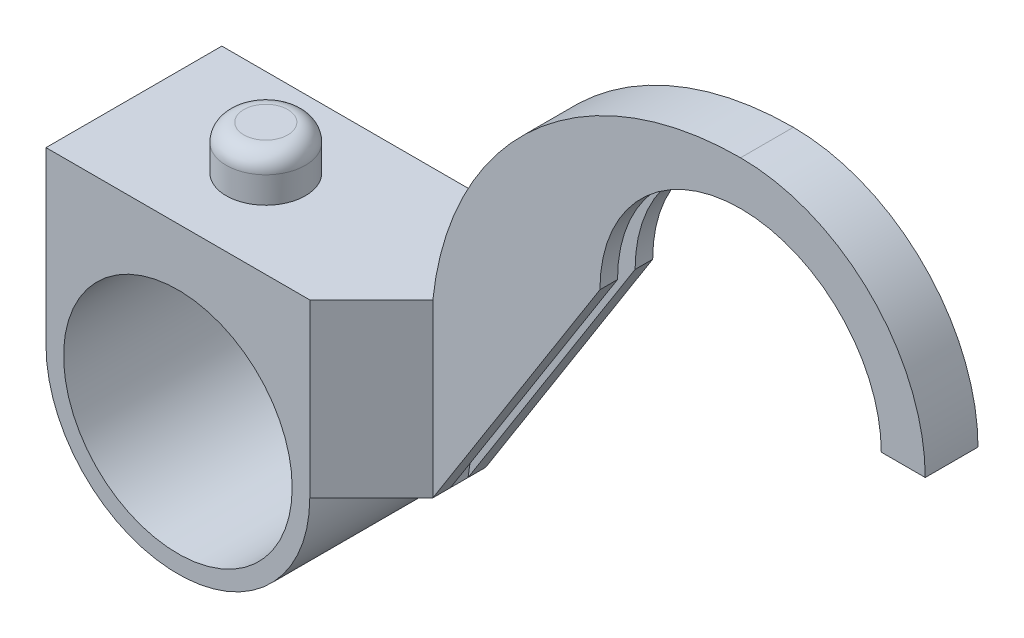
ISO-10303-21;
HEADER;
FILE_DESCRIPTION(('STEP AP214'),'2;1');
FILE_NAME('part.step','',(''),(''),'','','');
FILE_SCHEMA(('AUTOMOTIVE_DESIGN { 1 0 10303 214 1 1 1 1 }'));
ENDSEC;
DATA;
#1=APPLICATION_CONTEXT('core data for automotive mechanical design processes');
#2=APPLICATION_PROTOCOL_DEFINITION('international standard','automotive_design',2000,#1);
#3=PRODUCT_CONTEXT('',#1,'mechanical');
#4=PRODUCT('Part','Part','',(#3));
#5=PRODUCT_RELATED_PRODUCT_CATEGORY('part','',(#4));
#6=PRODUCT_DEFINITION_FORMATION('','',#4);
#7=PRODUCT_DEFINITION_CONTEXT('part definition',#1,'design');
#8=PRODUCT_DEFINITION('design','',#6,#7);
#9=PRODUCT_DEFINITION_SHAPE('','',#8);
#10=(LENGTH_UNIT() NAMED_UNIT(*) SI_UNIT(.MILLI.,.METRE.));
#11=(NAMED_UNIT(*) PLANE_ANGLE_UNIT() SI_UNIT($,.RADIAN.));
#12=(NAMED_UNIT(*) SI_UNIT($,.STERADIAN.) SOLID_ANGLE_UNIT());
#13=UNCERTAINTY_MEASURE_WITH_UNIT(LENGTH_MEASURE(1.E-05),#10,'distance_accuracy_value','');
#14=(GEOMETRIC_REPRESENTATION_CONTEXT(3) GLOBAL_UNCERTAINTY_ASSIGNED_CONTEXT((#13)) GLOBAL_UNIT_ASSIGNED_CONTEXT((#10,
#11,#12)) REPRESENTATION_CONTEXT('',''));
#15=CARTESIAN_POINT('',(0.,0.,0.));
#16=DIRECTION('',(0.,0.,1.));
#17=DIRECTION('',(1.,0.,0.));
#18=AXIS2_PLACEMENT_3D('',#15,#16,#17);
#19=CARTESIAN_POINT('',(57.,30.,1.));
#20=DIRECTION('',(0.,0.,1.));
#21=DIRECTION('',(1.,0.,0.));
#22=AXIS2_PLACEMENT_3D('',#19,#20,#21);
#23=CYLINDRICAL_SURFACE('',#22,16.);
#24=CARTESIAN_POINT('',(57.,30.,3.));
#25=DIRECTION('',(0.,0.,-1.));
#26=DIRECTION('',(1.,0.,0.));
#27=AXIS2_PLACEMENT_3D('',#24,#25,#26);
#28=CIRCLE('',#27,16.);
#29=CARTESIAN_POINT('',(41.,30.,3.));
#30=VERTEX_POINT('',#29);
#31=CARTESIAN_POINT('',(73.,30.,3.));
#32=VERTEX_POINT('',#31);
#33=EDGE_CURVE('E163',#30,#32,#28,.T.);
#34=ORIENTED_EDGE('',*,*,#33,.F.);
#35=DIRECTION('',(0.,0.,1.));
#36=VECTOR('',#35,1.);
#37=CARTESIAN_POINT('',(41.,30.,1.));
#38=LINE('',#37,#36);
#39=CARTESIAN_POINT('',(41.,30.,1.));
#40=VERTEX_POINT('',#39);
#41=EDGE_CURVE('E60',#40,#30,#38,.T.);
#42=ORIENTED_EDGE('',*,*,#41,.F.);
#43=CARTESIAN_POINT('',(57.,30.,1.));
#44=DIRECTION('',(0.,0.,-1.));
#45=DIRECTION('',(1.,0.,0.));
#46=AXIS2_PLACEMENT_3D('',#43,#44,#45);
#47=CIRCLE('',#46,16.);
#48=CARTESIAN_POINT('',(73.,30.,1.));
#49=VERTEX_POINT('',#48);
#50=EDGE_CURVE('E275',#40,#49,#47,.T.);
#51=ORIENTED_EDGE('',*,*,#50,.T.);
#52=DIRECTION('',(0.,0.,1.));
#53=VECTOR('',#52,1.);
#54=CARTESIAN_POINT('',(73.,30.,1.));
#55=LINE('',#54,#53);
#56=EDGE_CURVE('E83',#49,#32,#55,.T.);
#57=ORIENTED_EDGE('',*,*,#56,.T.);
#58=EDGE_LOOP('',(#34,#42,#51,#57));
#59=FACE_BOUND('',#58,.T.);
#60=ADVANCED_FACE('F43',(#59),#23,.F.);
#61=CARTESIAN_POINT('',(41.,30.,1.));
#62=DIRECTION('',(0.844819075554229,-0.535052081184345,0.));
#63=DIRECTION('',(0.535052081184345,0.844819075554229,0.));
#64=AXIS2_PLACEMENT_3D('',#61,#62,#63);
#65=PLANE('',#64);
#66=DIRECTION('',(0.535052081184345,0.844819075554228,0.));
#67=VECTOR('',#66,1.);
#68=CARTESIAN_POINT('',(41.,30.,3.));
#69=LINE('',#68,#67);
#70=CARTESIAN_POINT('',(22.,0.,3.));
#71=VERTEX_POINT('',#70);
#72=EDGE_CURVE('E74',#71,#30,#69,.T.);
#73=ORIENTED_EDGE('',*,*,#72,.F.);
#74=DIRECTION('',(0.,0.,-1.));
#75=VECTOR('',#74,1.);
#76=CARTESIAN_POINT('',(22.,0.,-3.));
#77=LINE('',#76,#75);
#78=CARTESIAN_POINT('',(22.,0.,1.));
#79=VERTEX_POINT('',#78);
#80=EDGE_CURVE('E197',#71,#79,#77,.T.);
#81=ORIENTED_EDGE('',*,*,#80,.T.);
#82=DIRECTION('',(0.535052081184345,0.844819075554228,0.));
#83=VECTOR('',#82,1.);
#84=CARTESIAN_POINT('',(41.,30.,1.));
#85=LINE('',#84,#83);
#86=EDGE_CURVE('E285',#79,#40,#85,.T.);
#87=ORIENTED_EDGE('',*,*,#86,.T.);
#88=ORIENTED_EDGE('',*,*,#41,.T.);
#89=EDGE_LOOP('',(#73,#81,#87,#88));
#90=FACE_BOUND('',#89,.T.);
#91=ADVANCED_FACE('F307',(#90),#65,.T.);
#92=CARTESIAN_POINT('',(73.,30.,1.));
#93=DIRECTION('',(0.,-1.,0.));
#94=DIRECTION('',(1.,0.,0.));
#95=AXIS2_PLACEMENT_3D('',#92,#93,#94);
#96=PLANE('',#95);
#97=DIRECTION('',(1.,0.,0.));
#98=VECTOR('',#97,1.);
#99=CARTESIAN_POINT('',(73.,30.,3.));
#100=LINE('',#99,#98);
#101=CARTESIAN_POINT('',(78.,30.,3.));
#102=VERTEX_POINT('',#101);
#103=EDGE_CURVE('E156',#32,#102,#100,.T.);
#104=ORIENTED_EDGE('',*,*,#103,.F.);
#105=ORIENTED_EDGE('',*,*,#56,.F.);
#106=DIRECTION('',(1.,0.,0.));
#107=VECTOR('',#106,1.);
#108=CARTESIAN_POINT('',(73.,30.,1.));
#109=LINE('',#108,#107);
#110=CARTESIAN_POINT('',(76.,30.,1.));
#111=VERTEX_POINT('',#110);
#112=EDGE_CURVE('E277',#49,#111,#109,.T.);
#113=ORIENTED_EDGE('',*,*,#112,.T.);
#114=DIRECTION('',(0.,0.,-1.));
#115=VECTOR('',#114,1.);
#116=CARTESIAN_POINT('',(76.,30.,3.));
#117=LINE('',#116,#115);
#118=CARTESIAN_POINT('',(76.,30.,-1.));
#119=VERTEX_POINT('',#118);
#120=EDGE_CURVE('E172',#111,#119,#117,.T.);
#121=ORIENTED_EDGE('',*,*,#120,.T.);
#122=DIRECTION('',(1.,0.,0.));
#123=VECTOR('',#122,1.);
#124=CARTESIAN_POINT('',(73.,30.,-1.));
#125=LINE('',#124,#123);
#126=CARTESIAN_POINT('',(73.,30.,-1.));
#127=VERTEX_POINT('',#126);
#128=EDGE_CURVE('E251',#127,#119,#125,.T.);
#129=ORIENTED_EDGE('',*,*,#128,.F.);
#130=DIRECTION('',(0.,0.,-1.));
#131=VECTOR('',#130,1.);
#132=CARTESIAN_POINT('',(73.,30.,-1.));
#133=LINE('',#132,#131);
#134=CARTESIAN_POINT('',(73.,30.,-3.));
#135=VERTEX_POINT('',#134);
#136=EDGE_CURVE('E263',#127,#135,#133,.T.);
#137=ORIENTED_EDGE('',*,*,#136,.T.);
#138=DIRECTION('',(1.,0.,0.));
#139=VECTOR('',#138,1.);
#140=CARTESIAN_POINT('',(73.,30.,-3.));
#141=LINE('',#140,#139);
#142=CARTESIAN_POINT('',(78.,30.,-3.));
#143=VERTEX_POINT('',#142);
#144=EDGE_CURVE('E169',#135,#143,#141,.T.);
#145=ORIENTED_EDGE('',*,*,#144,.T.);
#146=DIRECTION('',(0.,0.,-1.));
#147=VECTOR('',#146,1.);
#148=CARTESIAN_POINT('',(78.,30.,3.));
#149=LINE('',#148,#147);
#150=EDGE_CURVE('E166',#102,#143,#149,.T.);
#151=ORIENTED_EDGE('',*,*,#150,.F.);
#152=EDGE_LOOP('',(#104,#105,#113,#121,#129,#137,#145,#151));
#153=FACE_BOUND('',#152,.T.);
#154=ADVANCED_FACE('F167',(#153),#96,.T.);
#155=CARTESIAN_POINT('',(57.,30.,1.));
#156=DIRECTION('',(0.,0.,1.));
#157=DIRECTION('',(1.,0.,0.));
#158=AXIS2_PLACEMENT_3D('',#155,#156,#157);
#159=PLANE('',#158);
#160=ORIENTED_EDGE('',*,*,#50,.F.);
#161=ORIENTED_EDGE('',*,*,#86,.F.);
#162=CARTESIAN_POINT('',(93.8029379826637,-8.57198833355658,1.));
#163=DIRECTION('',(0.,0.,1.));
#164=DIRECTION('',(-1.,0.,0.));
#165=AXIS2_PLACEMENT_3D('',#162,#163,#164);
#166=CIRCLE('',#165,72.3127989150805);
#167=CARTESIAN_POINT('',(43.8839033796665,43.7465635504324,1.));
#168=VERTEX_POINT('',#167);
#169=EDGE_CURVE('E282',#168,#79,#166,.T.);
#170=ORIENTED_EDGE('',*,*,#169,.F.);
#171=CARTESIAN_POINT('',(57.,30.,1.));
#172=DIRECTION('',(0.,0.,1.));
#173=DIRECTION('',(1.,0.,0.));
#174=AXIS2_PLACEMENT_3D('',#171,#172,#173);
#175=CIRCLE('',#174,19.);
#176=EDGE_CURVE('E279',#111,#168,#175,.T.);
#177=ORIENTED_EDGE('',*,*,#176,.F.);
#178=ORIENTED_EDGE('',*,*,#112,.F.);
#179=EDGE_LOOP('',(#160,#161,#170,#177,#178));
#180=FACE_BOUND('',#179,.T.);
#181=ADVANCED_FACE('F316',(#180),#159,.F.);
#182=CARTESIAN_POINT('',(57.,30.,3.));
#183=DIRECTION('',(0.,0.,1.));
#184=DIRECTION('',(1.,0.,0.));
#185=AXIS2_PLACEMENT_3D('',#182,#183,#184);
#186=PLANE('',#185);
#187=ORIENTED_EDGE('',*,*,#33,.T.);
#188=ORIENTED_EDGE('',*,*,#103,.T.);
#189=CARTESIAN_POINT('',(57.,30.,3.));
#190=DIRECTION('',(0.,0.,1.));
#191=DIRECTION('',(-1.,0.,0.));
#192=AXIS2_PLACEMENT_3D('',#189,#190,#191);
#193=CIRCLE('',#192,21.);
#194=CARTESIAN_POINT('',(57.,51.,3.));
#195=VERTEX_POINT('',#194);
#196=EDGE_CURVE('E161',#102,#195,#193,.T.);
#197=ORIENTED_EDGE('',*,*,#196,.T.);
#198=CARTESIAN_POINT('',(57.,15.8055555555556,3.));
#199=DIRECTION('',(0.,0.,1.));
#200=DIRECTION('',(-1.,0.,0.));
#201=AXIS2_PLACEMENT_3D('',#198,#199,#200);
#202=CIRCLE('',#201,35.1944444444444);
#203=CARTESIAN_POINT('',(22.,19.5,3.));
#204=VERTEX_POINT('',#203);
#205=EDGE_CURVE('E178',#195,#204,#202,.T.);
#206=ORIENTED_EDGE('',*,*,#205,.T.);
#207=DIRECTION('',(0.,1.,0.));
#208=VECTOR('',#207,1.);
#209=CARTESIAN_POINT('',(22.,0.,3.));
#210=LINE('',#209,#208);
#211=EDGE_CURVE('E202',#71,#204,#210,.T.);
#212=ORIENTED_EDGE('',*,*,#211,.F.);
#213=ORIENTED_EDGE('',*,*,#72,.T.);
#214=EDGE_LOOP('',(#187,#188,#197,#206,#212,#213));
#215=FACE_BOUND('',#214,.T.);
#216=ADVANCED_FACE('F158',(#215),#186,.T.);
#217=CARTESIAN_POINT('',(93.8029379826633,-8.57198833355644,3.));
#218=DIRECTION('',(0.,0.,-1.));
#219=DIRECTION('',(-1.,0.,0.));
#220=AXIS2_PLACEMENT_3D('',#217,#218,#219);
#221=CYLINDRICAL_SURFACE('',#220,72.3127989150802);
#222=DIRECTION('',(0.,0.,-1.));
#223=VECTOR('',#222,1.);
#224=CARTESIAN_POINT('',(43.8839033796665,43.7465635504324,3.));
#225=LINE('',#224,#223);
#226=CARTESIAN_POINT('',(43.8839033796665,43.7465635504324,-1.));
#227=VERTEX_POINT('',#226);
#228=EDGE_CURVE('E189',#168,#227,#225,.T.);
#229=ORIENTED_EDGE('',*,*,#228,.F.);
#230=ORIENTED_EDGE('',*,*,#169,.T.);
#231=CARTESIAN_POINT('',(22.,0.,-1.));
#232=VERTEX_POINT('',#231);
#233=EDGE_CURVE('E195',#79,#232,#77,.T.);
#234=ORIENTED_EDGE('',*,*,#233,.T.);
#235=CARTESIAN_POINT('',(93.8029379826637,-8.57198833355658,-1.));
#236=DIRECTION('',(0.,0.,1.));
#237=DIRECTION('',(-1.,0.,0.));
#238=AXIS2_PLACEMENT_3D('',#235,#236,#237);
#239=CIRCLE('',#238,72.3127989150805);
#240=EDGE_CURVE('E258',#227,#232,#239,.T.);
#241=ORIENTED_EDGE('',*,*,#240,.F.);
#242=EDGE_LOOP('',(#229,#230,#234,#241));
#243=FACE_BOUND('',#242,.T.);
#244=ADVANCED_FACE('F320',(#243),#221,.F.);
#245=CARTESIAN_POINT('',(57.,30.,3.));
#246=DIRECTION('',(0.,0.,-1.));
#247=DIRECTION('',(-1.,0.,0.));
#248=AXIS2_PLACEMENT_3D('',#245,#246,#247);
#249=CYLINDRICAL_SURFACE('',#248,19.);
#250=ORIENTED_EDGE('',*,*,#120,.F.);
#251=ORIENTED_EDGE('',*,*,#176,.T.);
#252=ORIENTED_EDGE('',*,*,#228,.T.);
#253=CARTESIAN_POINT('',(57.,30.,-1.));
#254=DIRECTION('',(0.,0.,1.));
#255=DIRECTION('',(1.,0.,0.));
#256=AXIS2_PLACEMENT_3D('',#253,#254,#255);
#257=CIRCLE('',#256,19.);
#258=EDGE_CURVE('E255',#119,#227,#257,.T.);
#259=ORIENTED_EDGE('',*,*,#258,.F.);
#260=EDGE_LOOP('',(#250,#251,#252,#259));
#261=FACE_BOUND('',#260,.T.);
#262=ADVANCED_FACE('F328',(#261),#249,.F.);
#263=CARTESIAN_POINT('',(57.,30.,-1.));
#264=DIRECTION('',(0.,0.,-1.));
#265=DIRECTION('',(1.,0.,0.));
#266=AXIS2_PLACEMENT_3D('',#263,#264,#265);
#267=CYLINDRICAL_SURFACE('',#266,16.);
#268=CARTESIAN_POINT('',(57.,30.,-3.));
#269=DIRECTION('',(0.,0.,-1.));
#270=DIRECTION('',(1.,0.,0.));
#271=AXIS2_PLACEMENT_3D('',#268,#269,#270);
#272=CIRCLE('',#271,16.);
#273=CARTESIAN_POINT('',(41.,30.,-3.));
#274=VERTEX_POINT('',#273);
#275=EDGE_CURVE('E247',#274,#135,#272,.T.);
#276=ORIENTED_EDGE('',*,*,#275,.T.);
#277=ORIENTED_EDGE('',*,*,#136,.F.);
#278=CARTESIAN_POINT('',(57.,30.,-1.));
#279=DIRECTION('',(0.,0.,-1.));
#280=DIRECTION('',(1.,0.,0.));
#281=AXIS2_PLACEMENT_3D('',#278,#279,#280);
#282=CIRCLE('',#281,16.);
#283=CARTESIAN_POINT('',(41.,30.,-1.));
#284=VERTEX_POINT('',#283);
#285=EDGE_CURVE('E248',#284,#127,#282,.T.);
#286=ORIENTED_EDGE('',*,*,#285,.F.);
#287=DIRECTION('',(0.,0.,-1.));
#288=VECTOR('',#287,1.);
#289=CARTESIAN_POINT('',(41.,30.,-1.));
#290=LINE('',#289,#288);
#291=EDGE_CURVE('E268',#284,#274,#290,.T.);
#292=ORIENTED_EDGE('',*,*,#291,.T.);
#293=EDGE_LOOP('',(#276,#277,#286,#292));
#294=FACE_BOUND('',#293,.T.);
#295=ADVANCED_FACE('F324',(#294),#267,.F.);
#296=CARTESIAN_POINT('',(41.,30.,-1.));
#297=DIRECTION('',(0.844819075554229,-0.535052081184345,0.));
#298=DIRECTION('',(0.535052081184345,0.844819075554229,0.));
#299=AXIS2_PLACEMENT_3D('',#296,#297,#298);
#300=PLANE('',#299);
#301=DIRECTION('',(0.535052081184345,0.844819075554228,0.));
#302=VECTOR('',#301,1.);
#303=CARTESIAN_POINT('',(41.,30.,-3.));
#304=LINE('',#303,#302);
#305=CARTESIAN_POINT('',(22.,0.,-3.));
#306=VERTEX_POINT('',#305);
#307=EDGE_CURVE('E252',#306,#274,#304,.T.);
#308=ORIENTED_EDGE('',*,*,#307,.T.);
#309=ORIENTED_EDGE('',*,*,#291,.F.);
#310=DIRECTION('',(0.535052081184345,0.844819075554228,0.));
#311=VECTOR('',#310,1.);
#312=CARTESIAN_POINT('',(41.,30.,-1.));
#313=LINE('',#312,#311);
#314=EDGE_CURVE('E261',#232,#284,#313,.T.);
#315=ORIENTED_EDGE('',*,*,#314,.F.);
#316=DIRECTION('',(0.,0.,-1.));
#317=VECTOR('',#316,1.);
#318=CARTESIAN_POINT('',(22.,0.,-1.));
#319=LINE('',#318,#317);
#320=EDGE_CURVE('E271',#232,#306,#319,.T.);
#321=ORIENTED_EDGE('',*,*,#320,.T.);
#322=EDGE_LOOP('',(#308,#309,#315,#321));
#323=FACE_BOUND('',#322,.T.);
#324=ADVANCED_FACE('F327',(#323),#300,.T.);
#325=CARTESIAN_POINT('',(57.,30.,-1.));
#326=DIRECTION('',(0.,0.,-1.));
#327=DIRECTION('',(1.,0.,0.));
#328=AXIS2_PLACEMENT_3D('',#325,#326,#327);
#329=PLANE('',#328);
#330=ORIENTED_EDGE('',*,*,#285,.T.);
#331=ORIENTED_EDGE('',*,*,#128,.T.);
#332=ORIENTED_EDGE('',*,*,#258,.T.);
#333=ORIENTED_EDGE('',*,*,#240,.T.);
#334=ORIENTED_EDGE('',*,*,#314,.T.);
#335=EDGE_LOOP('',(#330,#331,#332,#333,#334));
#336=FACE_BOUND('',#335,.T.);
#337=ADVANCED_FACE('F332',(#336),#329,.F.);
#338=CARTESIAN_POINT('',(57.,30.,-3.));
#339=DIRECTION('',(0.,0.,-1.));
#340=DIRECTION('',(1.,0.,0.));
#341=AXIS2_PLACEMENT_3D('',#338,#339,#340);
#342=PLANE('',#341);
#343=ORIENTED_EDGE('',*,*,#307,.F.);
#344=DIRECTION('',(0.,1.,0.));
#345=VECTOR('',#344,1.);
#346=CARTESIAN_POINT('',(22.,0.,-3.));
#347=LINE('',#346,#345);
#348=CARTESIAN_POINT('',(22.,19.5,-3.));
#349=VERTEX_POINT('',#348);
#350=EDGE_CURVE('E209',#306,#349,#347,.T.);
#351=ORIENTED_EDGE('',*,*,#350,.T.);
#352=CARTESIAN_POINT('',(57.,15.8055555555556,-3.));
#353=DIRECTION('',(0.,0.,1.));
#354=DIRECTION('',(-1.,0.,0.));
#355=AXIS2_PLACEMENT_3D('',#352,#353,#354);
#356=CIRCLE('',#355,35.1944444444444);
#357=CARTESIAN_POINT('',(57.,51.,-3.));
#358=VERTEX_POINT('',#357);
#359=EDGE_CURVE('E184',#358,#349,#356,.T.);
#360=ORIENTED_EDGE('',*,*,#359,.F.);
#361=CARTESIAN_POINT('',(57.,30.,-3.));
#362=DIRECTION('',(0.,0.,1.));
#363=DIRECTION('',(-1.,0.,0.));
#364=AXIS2_PLACEMENT_3D('',#361,#362,#363);
#365=CIRCLE('',#364,21.);
#366=EDGE_CURVE('E181',#143,#358,#365,.T.);
#367=ORIENTED_EDGE('',*,*,#366,.F.);
#368=ORIENTED_EDGE('',*,*,#144,.F.);
#369=ORIENTED_EDGE('',*,*,#275,.F.);
#370=EDGE_LOOP('',(#343,#351,#360,#367,#368,#369));
#371=FACE_BOUND('',#370,.T.);
#372=ADVANCED_FACE('F334',(#371),#342,.T.);
#373=CARTESIAN_POINT('',(0.,0.,10.));
#374=DIRECTION('',(0.,0.,1.));
#375=DIRECTION('',(1.,0.,0.));
#376=AXIS2_PLACEMENT_3D('',#373,#374,#375);
#377=PLANE('',#376);
#378=CARTESIAN_POINT('',(0.,0.,10.));
#379=DIRECTION('',(0.,0.,1.));
#380=DIRECTION('',(1.,0.,0.));
#381=AXIS2_PLACEMENT_3D('',#378,#379,#380);
#382=CIRCLE('',#381,15.);
#383=CARTESIAN_POINT('',(-15.,0.,10.));
#384=VERTEX_POINT('',#383);
#385=CARTESIAN_POINT('',(15.,0.,10.));
#386=VERTEX_POINT('',#385);
#387=EDGE_CURVE('E220',#384,#386,#382,.T.);
#388=ORIENTED_EDGE('',*,*,#387,.T.);
#389=DIRECTION('',(0.,1.,0.));
#390=VECTOR('',#389,1.);
#391=CARTESIAN_POINT('',(15.,19.5,10.));
#392=LINE('',#391,#390);
#393=CARTESIAN_POINT('',(15.,19.5,10.));
#394=VERTEX_POINT('',#393);
#395=EDGE_CURVE('E223',#386,#394,#392,.T.);
#396=ORIENTED_EDGE('',*,*,#395,.T.);
#397=DIRECTION('',(-1.,0.,0.));
#398=VECTOR('',#397,1.);
#399=CARTESIAN_POINT('',(-15.,19.5,10.));
#400=LINE('',#399,#398);
#401=CARTESIAN_POINT('',(-15.,19.5,10.));
#402=VERTEX_POINT('',#401);
#403=EDGE_CURVE('E227',#394,#402,#400,.T.);
#404=ORIENTED_EDGE('',*,*,#403,.T.);
#405=DIRECTION('',(0.,-1.,0.));
#406=VECTOR('',#405,1.);
#407=CARTESIAN_POINT('',(-15.,0.,10.));
#408=LINE('',#407,#406);
#409=EDGE_CURVE('E229',#402,#384,#408,.T.);
#410=ORIENTED_EDGE('',*,*,#409,.T.);
#411=EDGE_LOOP('',(#388,#396,#404,#410));
#412=FACE_BOUND('',#411,.T.);
#413=CARTESIAN_POINT('',(0.,0.,10.));
#414=DIRECTION('',(0.,0.,1.));
#415=DIRECTION('',(1.,0.,0.));
#416=AXIS2_PLACEMENT_3D('',#413,#414,#415);
#417=CIRCLE('',#416,13.);
#418=CARTESIAN_POINT('',(13.,0.,10.));
#419=VERTEX_POINT('',#418);
#420=EDGE_CURVE('E214',#419,#419,#417,.T.);
#421=ORIENTED_EDGE('',*,*,#420,.F.);
#422=EDGE_LOOP('',(#421));
#423=FACE_BOUND('',#422,.T.);
#424=ADVANCED_FACE('F337',(#412,#423),#377,.T.);
#425=CARTESIAN_POINT('',(0.,0.,-10.));
#426=DIRECTION('',(0.,0.,1.));
#427=DIRECTION('',(1.,0.,0.));
#428=AXIS2_PLACEMENT_3D('',#425,#426,#427);
#429=PLANE('',#428);
#430=CARTESIAN_POINT('',(0.,0.,-10.));
#431=DIRECTION('',(0.,0.,1.));
#432=DIRECTION('',(1.,0.,0.));
#433=AXIS2_PLACEMENT_3D('',#430,#431,#432);
#434=CIRCLE('',#433,15.);
#435=CARTESIAN_POINT('',(-15.,0.,-10.));
#436=VERTEX_POINT('',#435);
#437=CARTESIAN_POINT('',(15.,0.,-10.));
#438=VERTEX_POINT('',#437);
#439=EDGE_CURVE('E217',#436,#438,#434,.T.);
#440=ORIENTED_EDGE('',*,*,#439,.F.);
#441=DIRECTION('',(0.,-1.,0.));
#442=VECTOR('',#441,1.);
#443=CARTESIAN_POINT('',(-15.,0.,-10.));
#444=LINE('',#443,#442);
#445=CARTESIAN_POINT('',(-15.,19.5,-10.));
#446=VERTEX_POINT('',#445);
#447=EDGE_CURVE('E224',#446,#436,#444,.T.);
#448=ORIENTED_EDGE('',*,*,#447,.F.);
#449=DIRECTION('',(-1.,0.,0.));
#450=VECTOR('',#449,1.);
#451=CARTESIAN_POINT('',(-15.,19.5,-10.));
#452=LINE('',#451,#450);
#453=CARTESIAN_POINT('',(15.,19.5,-10.));
#454=VERTEX_POINT('',#453);
#455=EDGE_CURVE('E237',#454,#446,#452,.T.);
#456=ORIENTED_EDGE('',*,*,#455,.F.);
#457=DIRECTION('',(0.,1.,0.));
#458=VECTOR('',#457,1.);
#459=CARTESIAN_POINT('',(15.,19.5,-10.));
#460=LINE('',#459,#458);
#461=EDGE_CURVE('E234',#438,#454,#460,.T.);
#462=ORIENTED_EDGE('',*,*,#461,.F.);
#463=EDGE_LOOP('',(#440,#448,#456,#462));
#464=FACE_BOUND('',#463,.T.);
#465=CARTESIAN_POINT('',(0.,0.,-10.));
#466=DIRECTION('',(0.,0.,1.));
#467=DIRECTION('',(1.,0.,0.));
#468=AXIS2_PLACEMENT_3D('',#465,#466,#467);
#469=CIRCLE('',#468,13.);
#470=CARTESIAN_POINT('',(13.,0.,-10.));
#471=VERTEX_POINT('',#470);
#472=EDGE_CURVE('E212',#471,#471,#469,.T.);
#473=ORIENTED_EDGE('',*,*,#472,.T.);
#474=EDGE_LOOP('',(#473));
#475=FACE_BOUND('',#474,.T.);
#476=ADVANCED_FACE('F346',(#464,#475),#429,.F.);
#477=CARTESIAN_POINT('',(0.,0.,10.));
#478=DIRECTION('',(0.,0.,-1.));
#479=DIRECTION('',(-1.,0.,0.));
#480=AXIS2_PLACEMENT_3D('',#477,#478,#479);
#481=CYLINDRICAL_SURFACE('',#480,15.);
#482=ORIENTED_EDGE('',*,*,#439,.T.);
#483=DIRECTION('',(0.,0.,-1.));
#484=VECTOR('',#483,1.);
#485=CARTESIAN_POINT('',(15.,0.,10.));
#486=LINE('',#485,#484);
#487=EDGE_CURVE('E245',#386,#438,#486,.T.);
#488=ORIENTED_EDGE('',*,*,#487,.F.);
#489=ORIENTED_EDGE('',*,*,#387,.F.);
#490=DIRECTION('',(0.,0.,-1.));
#491=VECTOR('',#490,1.);
#492=CARTESIAN_POINT('',(-15.,0.,10.));
#493=LINE('',#492,#491);
#494=EDGE_CURVE('E231',#384,#436,#493,.T.);
#495=ORIENTED_EDGE('',*,*,#494,.T.);
#496=EDGE_LOOP('',(#482,#488,#489,#495));
#497=FACE_BOUND('',#496,.T.);
#498=ADVANCED_FACE('F342',(#497),#481,.T.);
#499=CARTESIAN_POINT('',(-15.,19.5,10.));
#500=DIRECTION('',(0.,-1.,0.));
#501=DIRECTION('',(0.,0.,-1.));
#502=AXIS2_PLACEMENT_3D('',#499,#500,#501);
#503=PLANE('',#502);
#504=CARTESIAN_POINT('',(0.,19.5,0.));
#505=DIRECTION('',(0.,-1.,0.));
#506=DIRECTION('',(0.,0.,-1.));
#507=AXIS2_PLACEMENT_3D('',#504,#505,#506);
#508=CIRCLE('',#507,4.5);
#509=CARTESIAN_POINT('',(0.,19.5,-4.5));
#510=VERTEX_POINT('',#509);
#511=EDGE_CURVE('E290',#510,#510,#508,.F.);
#512=ORIENTED_EDGE('',*,*,#511,.F.);
#513=EDGE_LOOP('',(#512));
#514=FACE_BOUND('',#513,.T.);
#515=ORIENTED_EDGE('',*,*,#455,.T.);
#516=DIRECTION('',(0.,0.,-1.));
#517=VECTOR('',#516,1.);
#518=CARTESIAN_POINT('',(-15.,19.5,10.));
#519=LINE('',#518,#517);
#520=EDGE_CURVE('E242',#402,#446,#519,.T.);
#521=ORIENTED_EDGE('',*,*,#520,.F.);
#522=ORIENTED_EDGE('',*,*,#403,.F.);
#523=DIRECTION('',(0.707106781186547,0.,-0.707106781186547));
#524=VECTOR('',#523,1.);
#525=CARTESIAN_POINT('',(22.,19.5,3.));
#526=LINE('',#525,#524);
#527=EDGE_CURVE('E191',#394,#204,#526,.T.);
#528=ORIENTED_EDGE('',*,*,#527,.T.);
#529=DIRECTION('',(0.,0.,-1.));
#530=VECTOR('',#529,1.);
#531=CARTESIAN_POINT('',(22.,19.5,-3.));
#532=LINE('',#531,#530);
#533=EDGE_CURVE('E205',#204,#349,#532,.T.);
#534=ORIENTED_EDGE('',*,*,#533,.T.);
#535=DIRECTION('',(-0.707106781186547,0.,-0.707106781186547));
#536=VECTOR('',#535,1.);
#537=CARTESIAN_POINT('',(15.,19.5,-10.));
#538=LINE('',#537,#536);
#539=EDGE_CURVE('E196',#349,#454,#538,.T.);
#540=ORIENTED_EDGE('',*,*,#539,.T.);
#541=EDGE_LOOP('',(#515,#521,#522,#528,#534,#540));
#542=FACE_BOUND('',#541,.T.);
#543=ADVANCED_FACE('F345',(#514,#542),#503,.F.);
#544=CARTESIAN_POINT('',(-15.,0.,10.));
#545=DIRECTION('',(1.,0.,0.));
#546=DIRECTION('',(0.,1.,0.));
#547=AXIS2_PLACEMENT_3D('',#544,#545,#546);
#548=PLANE('',#547);
#549=ORIENTED_EDGE('',*,*,#447,.T.);
#550=ORIENTED_EDGE('',*,*,#494,.F.);
#551=ORIENTED_EDGE('',*,*,#409,.F.);
#552=ORIENTED_EDGE('',*,*,#520,.T.);
#553=EDGE_LOOP('',(#549,#550,#551,#552));
#554=FACE_BOUND('',#553,.T.);
#555=ADVANCED_FACE('F350',(#554),#548,.F.);
#556=CARTESIAN_POINT('',(0.,0.,10.));
#557=DIRECTION('',(0.,0.,-1.));
#558=DIRECTION('',(-1.,0.,0.));
#559=AXIS2_PLACEMENT_3D('',#556,#557,#558);
#560=CYLINDRICAL_SURFACE('',#559,13.);
#561=ORIENTED_EDGE('',*,*,#420,.T.);
#562=EDGE_LOOP('',(#561));
#563=FACE_BOUND('',#562,.T.);
#564=ORIENTED_EDGE('',*,*,#472,.F.);
#565=EDGE_LOOP('',(#564));
#566=FACE_BOUND('',#565,.T.);
#567=ADVANCED_FACE('F354',(#563,#566),#560,.F.);
#568=CARTESIAN_POINT('',(15.,0.,-10.));
#569=DIRECTION('',(0.707106781186547,0.,-0.707106781186548));
#570=DIRECTION('',(-0.707106781186548,0.,-0.707106781186547));
#571=AXIS2_PLACEMENT_3D('',#568,#569,#570);
#572=PLANE('',#571);
#573=ORIENTED_EDGE('',*,*,#539,.F.);
#574=ORIENTED_EDGE('',*,*,#350,.F.);
#575=DIRECTION('',(-0.707106781186547,0.,-0.707106781186547));
#576=VECTOR('',#575,1.);
#577=CARTESIAN_POINT('',(15.,0.,-10.));
#578=LINE('',#577,#576);
#579=EDGE_CURVE('E199',#306,#438,#578,.T.);
#580=ORIENTED_EDGE('',*,*,#579,.T.);
#581=ORIENTED_EDGE('',*,*,#461,.T.);
#582=EDGE_LOOP('',(#573,#574,#580,#581));
#583=FACE_BOUND('',#582,.T.);
#584=ADVANCED_FACE('F364',(#583),#572,.T.);
#585=CARTESIAN_POINT('',(22.,0.,3.));
#586=DIRECTION('',(0.707106781186547,0.,0.707106781186548));
#587=DIRECTION('',(0.707106781186548,0.,-0.707106781186547));
#588=AXIS2_PLACEMENT_3D('',#585,#586,#587);
#589=PLANE('',#588);
#590=ORIENTED_EDGE('',*,*,#527,.F.);
#591=ORIENTED_EDGE('',*,*,#395,.F.);
#592=DIRECTION('',(0.707106781186547,0.,-0.707106781186547));
#593=VECTOR('',#592,1.);
#594=CARTESIAN_POINT('',(22.,0.,3.));
#595=LINE('',#594,#593);
#596=EDGE_CURVE('E192',#386,#71,#595,.T.);
#597=ORIENTED_EDGE('',*,*,#596,.T.);
#598=ORIENTED_EDGE('',*,*,#211,.T.);
#599=EDGE_LOOP('',(#590,#591,#597,#598));
#600=FACE_BOUND('',#599,.T.);
#601=ADVANCED_FACE('F366',(#600),#589,.T.);
#602=CARTESIAN_POINT('',(0.,0.,0.));
#603=DIRECTION('',(0.,-1.,0.));
#604=DIRECTION('',(0.,0.,-1.));
#605=AXIS2_PLACEMENT_3D('',#602,#603,#604);
#606=PLANE('',#605);
#607=ORIENTED_EDGE('',*,*,#487,.T.);
#608=ORIENTED_EDGE('',*,*,#579,.F.);
#609=ORIENTED_EDGE('',*,*,#320,.F.);
#610=ORIENTED_EDGE('',*,*,#233,.F.);
#611=ORIENTED_EDGE('',*,*,#80,.F.);
#612=ORIENTED_EDGE('',*,*,#596,.F.);
#613=EDGE_LOOP('',(#607,#608,#609,#610,#611,#612));
#614=FACE_BOUND('',#613,.T.);
#615=ADVANCED_FACE('F369',(#614),#606,.T.);
#616=CARTESIAN_POINT('',(57.,15.8055555555556,3.));
#617=DIRECTION('',(0.,0.,-1.));
#618=DIRECTION('',(-1.,0.,0.));
#619=AXIS2_PLACEMENT_3D('',#616,#617,#618);
#620=CYLINDRICAL_SURFACE('',#619,35.1944444444444);
#621=ORIENTED_EDGE('',*,*,#359,.T.);
#622=ORIENTED_EDGE('',*,*,#533,.F.);
#623=ORIENTED_EDGE('',*,*,#205,.F.);
#624=DIRECTION('',(0.,0.,-1.));
#625=VECTOR('',#624,1.);
#626=CARTESIAN_POINT('',(57.,51.,3.));
#627=LINE('',#626,#625);
#628=EDGE_CURVE('E173',#195,#358,#627,.T.);
#629=ORIENTED_EDGE('',*,*,#628,.T.);
#630=EDGE_LOOP('',(#621,#622,#623,#629));
#631=FACE_BOUND('',#630,.T.);
#632=ADVANCED_FACE('F376',(#631),#620,.T.);
#633=CARTESIAN_POINT('',(57.,30.,3.));
#634=DIRECTION('',(0.,0.,-1.));
#635=DIRECTION('',(-1.,0.,0.));
#636=AXIS2_PLACEMENT_3D('',#633,#634,#635);
#637=CYLINDRICAL_SURFACE('',#636,21.);
#638=ORIENTED_EDGE('',*,*,#366,.T.);
#639=ORIENTED_EDGE('',*,*,#628,.F.);
#640=ORIENTED_EDGE('',*,*,#196,.F.);
#641=ORIENTED_EDGE('',*,*,#150,.T.);
#642=EDGE_LOOP('',(#638,#639,#640,#641));
#643=FACE_BOUND('',#642,.T.);
#644=ADVANCED_FACE('F175',(#643),#637,.T.);
#645=CARTESIAN_POINT('',(0.,24.5,0.));
#646=DIRECTION('',(0.,-1.,0.));
#647=DIRECTION('',(0.,0.,-1.));
#648=AXIS2_PLACEMENT_3D('',#645,#646,#647);
#649=CYLINDRICAL_SURFACE('',#648,4.5);
#650=CARTESIAN_POINT('',(0.,22.5,0.));
#651=DIRECTION('',(0.,1.,0.));
#652=DIRECTION('',(0.,0.,1.));
#653=AXIS2_PLACEMENT_3D('',#650,#651,#652);
#654=CIRCLE('',#653,4.5);
#655=CARTESIAN_POINT('',(0.,22.5,4.5));
#656=VERTEX_POINT('',#655);
#657=EDGE_CURVE('E11',#656,#656,#654,.F.);
#658=ORIENTED_EDGE('',*,*,#657,.T.);
#659=EDGE_LOOP('',(#658));
#660=FACE_BOUND('',#659,.T.);
#661=ORIENTED_EDGE('',*,*,#511,.T.);
#662=EDGE_LOOP('',(#661));
#663=FACE_BOUND('',#662,.T.);
#664=ADVANCED_FACE('F303',(#660,#663),#649,.T.);
#665=CARTESIAN_POINT('',(0.,24.5,0.));
#666=DIRECTION('',(0.,1.,0.));
#667=DIRECTION('',(0.,0.,1.));
#668=AXIS2_PLACEMENT_3D('',#665,#666,#667);
#669=PLANE('',#668);
#670=CARTESIAN_POINT('',(0.,24.5,0.));
#671=DIRECTION('',(0.,1.,0.));
#672=DIRECTION('',(0.,0.,1.));
#673=AXIS2_PLACEMENT_3D('',#670,#671,#672);
#674=CIRCLE('',#673,2.5);
#675=CARTESIAN_POINT('',(0.,24.5,2.5));
#676=VERTEX_POINT('',#675);
#677=EDGE_CURVE('E52',#676,#676,#674,.T.);
#678=ORIENTED_EDGE('',*,*,#677,.T.);
#679=EDGE_LOOP('',(#678));
#680=FACE_BOUND('',#679,.T.);
#681=ADVANCED_FACE('F296',(#680),#669,.T.);
#682=CARTESIAN_POINT('',(0.,22.5,0.));
#683=DIRECTION('',(0.,1.,0.));
#684=DIRECTION('',(0.,0.,1.));
#685=AXIS2_PLACEMENT_3D('',#682,#683,#684);
#686=TOROIDAL_SURFACE('',#685,2.5,2.);
#687=ORIENTED_EDGE('',*,*,#657,.F.);
#688=EDGE_LOOP('',(#687));
#689=FACE_BOUND('',#688,.T.);
#690=ORIENTED_EDGE('',*,*,#677,.F.);
#691=EDGE_LOOP('',(#690));
#692=FACE_BOUND('',#691,.T.);
#693=ADVANCED_FACE('F45',(#689,#692),#686,.T.);
#694=CLOSED_SHELL('',(#60,#91,#154,#181,#216,#244,#262,#295,#324,#337,#372,#424,#476,#498,#543,
#555,#567,#584,#601,#615,#632,#644,#664,#681,#693));
#695=MANIFOLD_SOLID_BREP('B2',#694);
#696=ADVANCED_BREP_SHAPE_REPRESENTATION('',(#18,#695),#14);
#697=SHAPE_DEFINITION_REPRESENTATION(#9,#696);
ENDSEC;
END-ISO-10303-21;
